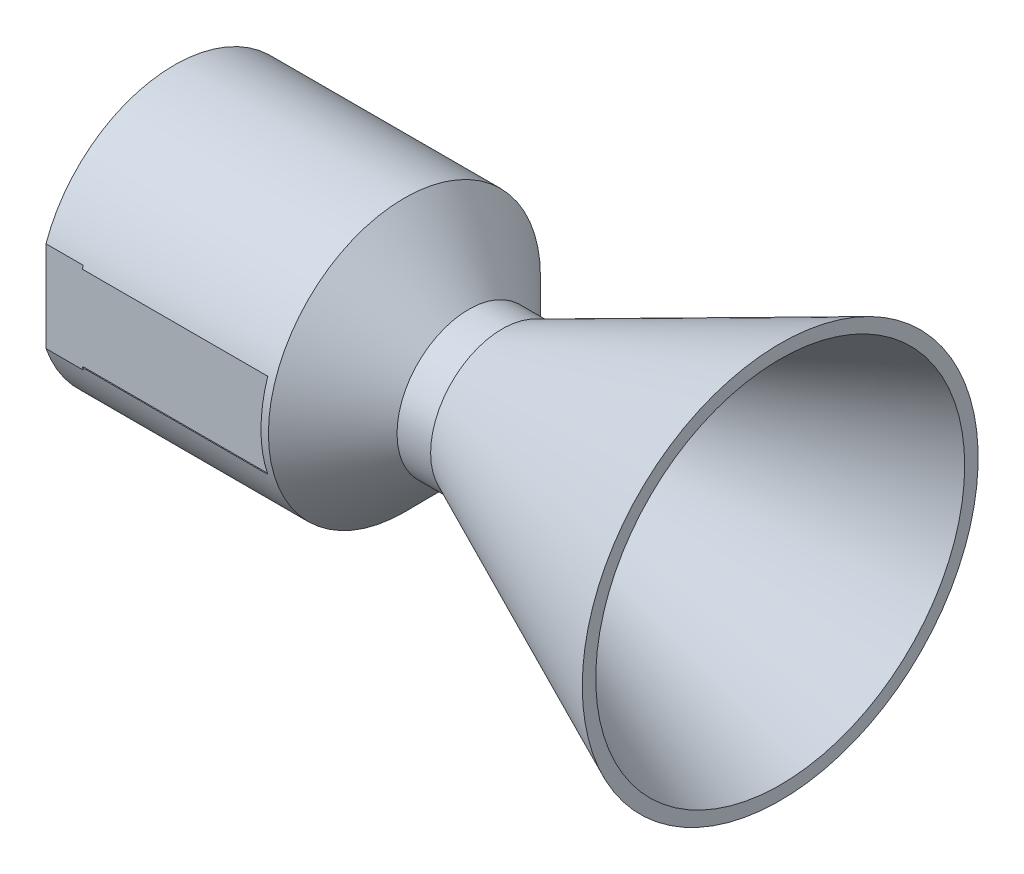
ISO-10303-21;
HEADER;
FILE_DESCRIPTION(('STEP AP214'),'2;1');
FILE_NAME('part.step','',(''),(''),'','','');
FILE_SCHEMA(('AUTOMOTIVE_DESIGN { 1 0 10303 214 1 1 1 1 }'));
ENDSEC;
DATA;
#1=APPLICATION_CONTEXT('core data for automotive mechanical design processes');
#2=APPLICATION_PROTOCOL_DEFINITION('international standard','automotive_design',2000,#1);
#3=PRODUCT_CONTEXT('',#1,'mechanical');
#4=PRODUCT('Part','Part','',(#3));
#5=PRODUCT_RELATED_PRODUCT_CATEGORY('part','',(#4));
#6=PRODUCT_DEFINITION_FORMATION('','',#4);
#7=PRODUCT_DEFINITION_CONTEXT('part definition',#1,'design');
#8=PRODUCT_DEFINITION('design','',#6,#7);
#9=PRODUCT_DEFINITION_SHAPE('','',#8);
#10=(LENGTH_UNIT() NAMED_UNIT(*) SI_UNIT(.MILLI.,.METRE.));
#11=(NAMED_UNIT(*) PLANE_ANGLE_UNIT() SI_UNIT($,.RADIAN.));
#12=(NAMED_UNIT(*) SI_UNIT($,.STERADIAN.) SOLID_ANGLE_UNIT());
#13=UNCERTAINTY_MEASURE_WITH_UNIT(LENGTH_MEASURE(1.E-05),#10,'distance_accuracy_value','');
#14=(GEOMETRIC_REPRESENTATION_CONTEXT(3) GLOBAL_UNCERTAINTY_ASSIGNED_CONTEXT((#13)) GLOBAL_UNIT_ASSIGNED_CONTEXT((#10,
#11,#12)) REPRESENTATION_CONTEXT('',''));
#15=CARTESIAN_POINT('',(0.,0.,0.));
#16=DIRECTION('',(0.,0.,1.));
#17=DIRECTION('',(1.,0.,0.));
#18=AXIS2_PLACEMENT_3D('',#15,#16,#17);
#19=CARTESIAN_POINT('',(-32.3129153036238,0.,-0.0551176881120801));
#20=DIRECTION('',(1.,0.,0.));
#21=DIRECTION('',(0.,0.,-1.));
#22=AXIS2_PLACEMENT_3D('',#19,#20,#21);
#23=PLANE('',#22);
#24=DIRECTION('',(0.,1.,0.));
#25=VECTOR('',#24,1.);
#26=CARTESIAN_POINT('',(-32.3129153036238,11.3983878311036,34.3140971361835));
#27=LINE('',#26,#25);
#28=CARTESIAN_POINT('',(-32.3129153036238,-12.1635987648434,34.3140971361835));
#29=VERTEX_POINT('',#28);
#30=CARTESIAN_POINT('',(-32.3129153036238,-11.3983878311036,34.3140971361835));
#31=VERTEX_POINT('',#30);
#32=EDGE_CURVE('E56',#29,#31,#27,.T.);
#33=ORIENTED_EDGE('',*,*,#32,.F.);
#34=CARTESIAN_POINT('',(-32.3129153036238,0.,-0.0551176881120801));
#35=DIRECTION('',(-1.,0.,0.));
#36=DIRECTION('',(0.,0.,1.));
#37=AXIS2_PLACEMENT_3D('',#34,#35,#36);
#38=CIRCLE('',#37,36.4581412382842);
#39=CARTESIAN_POINT('',(-32.3129153036238,-11.3983878311036,34.5754008959696));
#40=VERTEX_POINT('',#39);
#41=EDGE_CURVE('E180',#29,#40,#38,.T.);
#42=ORIENTED_EDGE('',*,*,#41,.T.);
#43=DIRECTION('',(0.,0.,-1.));
#44=VECTOR('',#43,1.);
#45=CARTESIAN_POINT('',(-32.3129153036238,-11.3983878311036,-0.0551176881120801));
#46=LINE('',#45,#44);
#47=EDGE_CURVE('E197',#40,#31,#46,.T.);
#48=ORIENTED_EDGE('',*,*,#47,.T.);
#49=EDGE_LOOP('',(#33,#42,#48));
#50=FACE_BOUND('',#49,.T.);
#51=ADVANCED_FACE('F46',(#50),#23,.F.);
#52=CARTESIAN_POINT('',(-32.3129153036238,11.3983878311036,34.3140971361835));
#53=VERTEX_POINT('',#52);
#54=CARTESIAN_POINT('',(-32.3129153036238,12.1635987648434,34.3140971361835));
#55=VERTEX_POINT('',#54);
#56=EDGE_CURVE('E12',#53,#55,#27,.T.);
#57=ORIENTED_EDGE('',*,*,#56,.F.);
#58=DIRECTION('',(0.,0.,1.));
#59=VECTOR('',#58,1.);
#60=CARTESIAN_POINT('',(-32.3129153036238,11.3983878311036,34.3140971361835));
#61=LINE('',#60,#59);
#62=CARTESIAN_POINT('',(-32.3129153036238,11.3983878311036,34.5754008959696));
#63=VERTEX_POINT('',#62);
#64=EDGE_CURVE('E153',#53,#63,#61,.T.);
#65=ORIENTED_EDGE('',*,*,#64,.T.);
#66=EDGE_CURVE('E183',#63,#55,#38,.T.);
#67=ORIENTED_EDGE('',*,*,#66,.T.);
#68=EDGE_LOOP('',(#57,#65,#67));
#69=FACE_BOUND('',#68,.T.);
#70=ADVANCED_FACE('F213',(#69),#23,.F.);
#71=CARTESIAN_POINT('',(120.108627169546,0.,-0.0551176881120801));
#72=DIRECTION('',(1.,0.,0.));
#73=DIRECTION('',(0.,0.,-1.));
#74=AXIS2_PLACEMENT_3D('',#71,#72,#73);
#75=PLANE('',#74);
#76=CARTESIAN_POINT('',(120.108627169546,0.,-0.0551176881120801));
#77=DIRECTION('',(-1.,0.,0.));
#78=DIRECTION('',(0.,0.,1.));
#79=AXIS2_PLACEMENT_3D('',#76,#77,#78);
#80=CIRCLE('',#79,49.4432064146147);
#81=CARTESIAN_POINT('',(120.108627169546,0.,-49.4983241027268));
#82=VERTEX_POINT('',#81);
#83=EDGE_CURVE('E168',#82,#82,#80,.T.);
#84=ORIENTED_EDGE('',*,*,#83,.T.);
#85=EDGE_LOOP('',(#84));
#86=FACE_BOUND('',#85,.T.);
#87=CARTESIAN_POINT('',(120.108627169546,0.,-0.0551176881120801));
#88=DIRECTION('',(-1.,0.,0.));
#89=DIRECTION('',(0.,0.,1.));
#90=AXIS2_PLACEMENT_3D('',#87,#88,#89);
#91=CIRCLE('',#90,53.0558164323668);
#92=CARTESIAN_POINT('',(120.108627169546,0.,53.0006987442547));
#93=VERTEX_POINT('',#92);
#94=EDGE_CURVE('E194',#93,#93,#91,.T.);
#95=ORIENTED_EDGE('',*,*,#94,.F.);
#96=EDGE_LOOP('',(#95));
#97=FACE_BOUND('',#96,.T.);
#98=ADVANCED_FACE('F48',(#86,#97),#75,.T.);
#99=CARTESIAN_POINT('',(45.6318795037904,0.,-0.0551176881120801));
#100=DIRECTION('',(1.,0.,0.));
#101=DIRECTION('',(0.,0.,-1.));
#102=AXIS2_PLACEMENT_3D('',#99,#100,#101);
#103=CONICAL_SURFACE('',#102,19.2220939213524,0.426412207877239);
#104=ORIENTED_EDGE('',*,*,#94,.T.);
#105=EDGE_LOOP('',(#104));
#106=FACE_BOUND('',#105,.T.);
#107=CARTESIAN_POINT('',(45.6318795037904,0.,-0.0551176881120801));
#108=DIRECTION('',(-1.,0.,0.));
#109=DIRECTION('',(0.,0.,1.));
#110=AXIS2_PLACEMENT_3D('',#107,#108,#109);
#111=CIRCLE('',#110,19.2220939213524);
#112=CARTESIAN_POINT('',(45.6318795037904,0.,19.1669762332403));
#113=VERTEX_POINT('',#112);
#114=EDGE_CURVE('E191',#113,#113,#111,.T.);
#115=ORIENTED_EDGE('',*,*,#114,.F.);
#116=EDGE_LOOP('',(#115));
#117=FACE_BOUND('',#116,.T.);
#118=ADVANCED_FACE('F238',(#106,#117),#103,.T.);
#119=CARTESIAN_POINT('',(-32.3129153036238,0.,-0.0551176881120801));
#120=DIRECTION('',(-1.,0.,0.));
#121=DIRECTION('',(0.,0.,1.));
#122=AXIS2_PLACEMENT_3D('',#119,#120,#121);
#123=CYLINDRICAL_SURFACE('',#122,19.2220939213524);
#124=ORIENTED_EDGE('',*,*,#114,.T.);
#125=EDGE_LOOP('',(#124));
#126=FACE_BOUND('',#125,.T.);
#127=CARTESIAN_POINT('',(36.6237395480277,0.,-0.0551176881120801));
#128=DIRECTION('',(-1.,0.,0.));
#129=DIRECTION('',(0.,0.,1.));
#130=AXIS2_PLACEMENT_3D('',#127,#128,#129);
#131=CIRCLE('',#130,19.2220939213524);
#132=CARTESIAN_POINT('',(36.6237395480277,0.,19.1669762332403));
#133=VERTEX_POINT('',#132);
#134=EDGE_CURVE('E188',#133,#133,#131,.T.);
#135=ORIENTED_EDGE('',*,*,#134,.F.);
#136=EDGE_LOOP('',(#135));
#137=FACE_BOUND('',#136,.T.);
#138=ADVANCED_FACE('F235',(#126,#137),#123,.T.);
#139=CARTESIAN_POINT('',(19.3876922310955,0.,-0.0551176881120801));
#140=DIRECTION('',(-1.,0.,0.));
#141=DIRECTION('',(0.,0.,1.));
#142=AXIS2_PLACEMENT_3D('',#139,#140,#141);
#143=CONICAL_SURFACE('',#142,36.4581412382842,0.785398163397437);
#144=ORIENTED_EDGE('',*,*,#134,.T.);
#145=EDGE_LOOP('',(#144));
#146=FACE_BOUND('',#145,.T.);
#147=CARTESIAN_POINT('',(19.3876922310955,0.,-0.0551176881120801));
#148=DIRECTION('',(-1.,0.,0.));
#149=DIRECTION('',(0.,0.,1.));
#150=AXIS2_PLACEMENT_3D('',#147,#148,#149);
#151=CIRCLE('',#150,36.4581412382842);
#152=CARTESIAN_POINT('',(19.3876922310955,0.,36.4030235501721));
#153=VERTEX_POINT('',#152);
#154=EDGE_CURVE('E185',#153,#153,#151,.T.);
#155=ORIENTED_EDGE('',*,*,#154,.F.);
#156=EDGE_LOOP('',(#155));
#157=FACE_BOUND('',#156,.T.);
#158=ADVANCED_FACE('F232',(#146,#157),#143,.T.);
#159=CARTESIAN_POINT('',(-32.3129153036238,0.,-0.0551176881120801));
#160=DIRECTION('',(-1.,0.,0.));
#161=DIRECTION('',(0.,0.,1.));
#162=AXIS2_PLACEMENT_3D('',#159,#160,#161);
#163=CYLINDRICAL_SURFACE('',#162,36.4581412382842);
#164=DIRECTION('',(1.,0.,0.));
#165=VECTOR('',#164,1.);
#166=CARTESIAN_POINT('',(-32.3129153036238,11.3983878311036,-34.6856362721937));
#167=LINE('',#166,#165);
#168=CARTESIAN_POINT('',(-42.3129153036238,11.3983878311036,-34.6856362721937));
#169=VERTEX_POINT('',#168);
#170=CARTESIAN_POINT('',(17.3920852119745,11.3983878311036,-34.6856362721937));
#171=VERTEX_POINT('',#170);
#172=EDGE_CURVE('E113',#169,#171,#167,.T.);
#173=ORIENTED_EDGE('',*,*,#172,.F.);
#174=CARTESIAN_POINT('',(-42.3129153036238,0.,-0.0551176881120801));
#175=DIRECTION('',(-1.,0.,0.));
#176=DIRECTION('',(0.,0.,1.));
#177=AXIS2_PLACEMENT_3D('',#174,#175,#176);
#178=CIRCLE('',#177,36.4581412382842);
#179=CARTESIAN_POINT('',(-42.3129153036238,12.1635987648434,34.3140971361835));
#180=VERTEX_POINT('',#179);
#181=EDGE_CURVE('E119',#180,#169,#178,.T.);
#182=ORIENTED_EDGE('',*,*,#181,.F.);
#183=DIRECTION('',(1.,0.,0.));
#184=VECTOR('',#183,1.);
#185=CARTESIAN_POINT('',(-42.3129153036238,12.1635987648434,34.3140971361835));
#186=LINE('',#185,#184);
#187=EDGE_CURVE('E141',#180,#55,#186,.T.);
#188=ORIENTED_EDGE('',*,*,#187,.T.);
#189=ORIENTED_EDGE('',*,*,#66,.F.);
#190=DIRECTION('',(-1.,0.,0.));
#191=VECTOR('',#190,1.);
#192=CARTESIAN_POINT('',(-32.3129153036238,11.3983878311036,34.5754008959696));
#193=LINE('',#192,#191);
#194=CARTESIAN_POINT('',(17.3920852119745,11.3983878311036,34.5754008959696));
#195=VERTEX_POINT('',#194);
#196=EDGE_CURVE('E166',#195,#63,#193,.T.);
#197=ORIENTED_EDGE('',*,*,#196,.F.);
#198=CARTESIAN_POINT('',(17.3920852119745,0.,-0.0551176881120801));
#199=DIRECTION('',(1.,0.,0.));
#200=DIRECTION('',(0.,0.,-1.));
#201=AXIS2_PLACEMENT_3D('',#198,#199,#200);
#202=CIRCLE('',#201,36.4581412382842);
#203=CARTESIAN_POINT('',(17.3920852119745,-11.3983878311036,34.5754008959696));
#204=VERTEX_POINT('',#203);
#205=EDGE_CURVE('E198',#204,#195,#202,.F.);
#206=ORIENTED_EDGE('',*,*,#205,.F.);
#207=DIRECTION('',(-1.,0.,0.));
#208=VECTOR('',#207,1.);
#209=CARTESIAN_POINT('',(-32.3129153036238,-11.3983878311036,34.5754008959696));
#210=LINE('',#209,#208);
#211=EDGE_CURVE('E124',#40,#204,#210,.F.);
#212=ORIENTED_EDGE('',*,*,#211,.F.);
#213=ORIENTED_EDGE('',*,*,#41,.F.);
#214=DIRECTION('',(1.,0.,0.));
#215=VECTOR('',#214,1.);
#216=CARTESIAN_POINT('',(-42.3129153036238,-12.1635987648434,34.3140971361835));
#217=LINE('',#216,#215);
#218=CARTESIAN_POINT('',(-42.3129153036238,-12.1635987648434,34.3140971361835));
#219=VERTEX_POINT('',#218);
#220=EDGE_CURVE('E144',#219,#29,#217,.T.);
#221=ORIENTED_EDGE('',*,*,#220,.F.);
#222=CARTESIAN_POINT('',(-42.3129153036238,0.,-0.0551176881120801));
#223=DIRECTION('',(-1.,0.,0.));
#224=DIRECTION('',(0.,0.,1.));
#225=AXIS2_PLACEMENT_3D('',#222,#223,#224);
#226=CIRCLE('',#225,36.4581412382842);
#227=CARTESIAN_POINT('',(-42.3129153036238,-11.3983878311036,-34.6856362721937));
#228=VERTEX_POINT('',#227);
#229=EDGE_CURVE('E132',#228,#219,#226,.T.);
#230=ORIENTED_EDGE('',*,*,#229,.F.);
#231=DIRECTION('',(1.,0.,0.));
#232=VECTOR('',#231,1.);
#233=CARTESIAN_POINT('',(-32.3129153036238,-11.3983878311036,-34.6856362721937));
#234=LINE('',#233,#232);
#235=CARTESIAN_POINT('',(17.3920852119745,-11.3983878311036,-34.6856362721937));
#236=VERTEX_POINT('',#235);
#237=EDGE_CURVE('E125',#228,#236,#234,.T.);
#238=ORIENTED_EDGE('',*,*,#237,.T.);
#239=CARTESIAN_POINT('',(17.3920852119745,0.,-0.0551176881120801));
#240=DIRECTION('',(1.,0.,0.));
#241=DIRECTION('',(0.,0.,-1.));
#242=AXIS2_PLACEMENT_3D('',#239,#240,#241);
#243=CIRCLE('',#242,36.4581412382842);
#244=EDGE_CURVE('E50',#171,#236,#243,.F.);
#245=ORIENTED_EDGE('',*,*,#244,.F.);
#246=EDGE_LOOP('',(#173,#182,#188,#189,#197,#206,#212,#213,#221,#230,#238,#245));
#247=FACE_BOUND('',#246,.T.);
#248=ORIENTED_EDGE('',*,*,#154,.T.);
#249=EDGE_LOOP('',(#248));
#250=FACE_BOUND('',#249,.T.);
#251=ADVANCED_FACE('F115',(#247,#250),#163,.T.);
#252=CARTESIAN_POINT('',(-32.3129153036238,0.,-0.0551176881120801));
#253=DIRECTION('',(-1.,0.,0.));
#254=DIRECTION('',(0.,0.,1.));
#255=AXIS2_PLACEMENT_3D('',#252,#253,#254);
#256=CYLINDRICAL_SURFACE('',#255,31.7842469209473);
#257=CARTESIAN_POINT('',(19.3876922310955,0.,-0.0551176881120801));
#258=DIRECTION('',(-1.,0.,0.));
#259=DIRECTION('',(0.,0.,1.));
#260=AXIS2_PLACEMENT_3D('',#257,#258,#259);
#261=CIRCLE('',#260,31.7842469209473);
#262=CARTESIAN_POINT('',(19.3876922310955,0.,31.7291292328352));
#263=VERTEX_POINT('',#262);
#264=EDGE_CURVE('E177',#263,#263,#261,.T.);
#265=ORIENTED_EDGE('',*,*,#264,.F.);
#266=EDGE_LOOP('',(#265));
#267=FACE_BOUND('',#266,.T.);
#268=CARTESIAN_POINT('',(-32.3129153036238,0.,-0.0551176881120801));
#269=DIRECTION('',(-1.,0.,0.));
#270=DIRECTION('',(0.,0.,1.));
#271=AXIS2_PLACEMENT_3D('',#268,#269,#270);
#272=CIRCLE('',#271,31.7842469209473);
#273=CARTESIAN_POINT('',(-32.3129153036238,0.,31.7291292328352));
#274=VERTEX_POINT('',#273);
#275=EDGE_CURVE('E147',#274,#274,#272,.T.);
#276=ORIENTED_EDGE('',*,*,#275,.T.);
#277=EDGE_LOOP('',(#276));
#278=FACE_BOUND('',#277,.T.);
#279=ADVANCED_FACE('F228',(#267,#278),#256,.F.);
#280=CARTESIAN_POINT('',(19.3876922310955,0.,-0.0551176881120801));
#281=DIRECTION('',(-1.,0.,0.));
#282=DIRECTION('',(0.,0.,1.));
#283=AXIS2_PLACEMENT_3D('',#280,#281,#282);
#284=CONICAL_SURFACE('',#283,31.7842469209473,0.785398163397436);
#285=CARTESIAN_POINT('',(35.6123372706298,0.,-0.0551176881120801));
#286=DIRECTION('',(-1.,0.,0.));
#287=DIRECTION('',(0.,0.,1.));
#288=AXIS2_PLACEMENT_3D('',#285,#286,#287);
#289=CIRCLE('',#288,15.5596018814134);
#290=CARTESIAN_POINT('',(35.6123372706298,0.,15.5044841933013));
#291=VERTEX_POINT('',#290);
#292=EDGE_CURVE('E174',#291,#291,#289,.T.);
#293=ORIENTED_EDGE('',*,*,#292,.F.);
#294=EDGE_LOOP('',(#293));
#295=FACE_BOUND('',#294,.T.);
#296=ORIENTED_EDGE('',*,*,#264,.T.);
#297=EDGE_LOOP('',(#296));
#298=FACE_BOUND('',#297,.T.);
#299=ADVANCED_FACE('F267',(#295,#298),#284,.F.);
#300=CARTESIAN_POINT('',(-32.3129153036238,0.,-0.0551176881120801));
#301=DIRECTION('',(-1.,0.,0.));
#302=DIRECTION('',(0.,0.,1.));
#303=AXIS2_PLACEMENT_3D('',#300,#301,#302);
#304=CYLINDRICAL_SURFACE('',#303,15.5596018814134);
#305=CARTESIAN_POINT('',(45.6318795037904,0.,-0.0551176881120801));
#306=DIRECTION('',(-1.,0.,0.));
#307=DIRECTION('',(0.,0.,1.));
#308=AXIS2_PLACEMENT_3D('',#305,#306,#307);
#309=CIRCLE('',#308,15.5596018814134);
#310=CARTESIAN_POINT('',(45.6318795037904,0.,-15.6147195695255));
#311=VERTEX_POINT('',#310);
#312=EDGE_CURVE('E171',#311,#311,#309,.T.);
#313=ORIENTED_EDGE('',*,*,#312,.F.);
#314=EDGE_LOOP('',(#313));
#315=FACE_BOUND('',#314,.T.);
#316=ORIENTED_EDGE('',*,*,#292,.T.);
#317=EDGE_LOOP('',(#316));
#318=FACE_BOUND('',#317,.T.);
#319=ADVANCED_FACE('F261',(#315,#318),#304,.F.);
#320=CARTESIAN_POINT('',(45.6318795037904,0.,-0.0551176881120801));
#321=DIRECTION('',(1.,0.,0.));
#322=DIRECTION('',(0.,0.,-1.));
#323=AXIS2_PLACEMENT_3D('',#320,#321,#322);
#324=CONICAL_SURFACE('',#323,15.5596018814134,0.426967256807075);
#325=CARTESIAN_POINT('',(120.108627169546,0.,-49.4983241027268));
#326=CARTESIAN_POINT('',(119.332827714694,0.,-49.1453698888393));
#327=CARTESIAN_POINT('',(118.557028259843,0.,-48.7924156749518));
#328=CARTESIAN_POINT('',(117.005429350139,0.,-48.0865072471767));
#329=CARTESIAN_POINT('',(116.229629895288,0.,-47.7335530332892));
#330=CARTESIAN_POINT('',(114.678030985585,0.,-47.0276446055142));
#331=CARTESIAN_POINT('',(113.902231530733,0.,-46.6746903916267));
#332=CARTESIAN_POINT('',(112.35063262103,0.,-45.9687819638517));
#333=CARTESIAN_POINT('',(111.574833166178,0.,-45.6158277499642));
#334=CARTESIAN_POINT('',(110.023234256475,0.,-44.9099193221891));
#335=CARTESIAN_POINT('',(109.247434801623,0.,-44.5569651083016));
#336=CARTESIAN_POINT('',(107.69583589192,0.,-43.8510566805266));
#337=CARTESIAN_POINT('',(106.920036437068,0.,-43.4981024666391));
#338=CARTESIAN_POINT('',(105.368437527365,0.,-42.792194038864));
#339=CARTESIAN_POINT('',(104.592638072514,0.,-42.4392398249765));
#340=CARTESIAN_POINT('',(103.04103916281,0.,-41.7333313972015));
#341=CARTESIAN_POINT('',(102.265239707959,0.,-41.380377183314));
#342=CARTESIAN_POINT('',(100.713640798255,0.,-40.674468755539));
#343=CARTESIAN_POINT('',(99.9378413434038,0.,-40.3215145416514));
#344=CARTESIAN_POINT('',(98.3862424337006,0.,-39.6156061138764));
#345=CARTESIAN_POINT('',(97.6104429788489,0.,-39.2626518999889));
#346=CARTESIAN_POINT('',(96.0588440691457,0.,-38.5567434722139));
#347=CARTESIAN_POINT('',(95.2830446142941,0.,-38.2037892583264));
#348=CARTESIAN_POINT('',(93.7314457045908,0.,-37.4978808305513));
#349=CARTESIAN_POINT('',(92.9556462497392,0.,-37.1449266166638));
#350=CARTESIAN_POINT('',(91.404047340036,0.,-36.4390181888888));
#351=CARTESIAN_POINT('',(90.6282478851844,0.,-36.0860639750013));
#352=CARTESIAN_POINT('',(89.0766489754811,0.,-35.3801555472263));
#353=CARTESIAN_POINT('',(88.3008495206295,0.,-35.0272013333387));
#354=CARTESIAN_POINT('',(86.7492506109262,0.,-34.3212929055637));
#355=CARTESIAN_POINT('',(85.9734511560746,0.,-33.9683386916762));
#356=CARTESIAN_POINT('',(84.4218522463714,0.,-33.2624302639012));
#357=CARTESIAN_POINT('',(83.6460527915198,0.,-32.9094760500137));
#358=CARTESIAN_POINT('',(82.0944538818165,0.,-32.2035676222386));
#359=CARTESIAN_POINT('',(81.3186544269649,0.,-31.8506134083511));
#360=CARTESIAN_POINT('',(79.7670555172617,0.,-31.1447049805761));
#361=CARTESIAN_POINT('',(78.99125606241,0.,-30.7917507666886));
#362=CARTESIAN_POINT('',(77.4396571527068,0.,-30.0858423389136));
#363=CARTESIAN_POINT('',(76.6638576978552,0.,-29.732888125026));
#364=CARTESIAN_POINT('',(75.1122587881519,0.,-29.026979697251));
#365=CARTESIAN_POINT('',(74.3364593333003,0.,-28.6740254833635));
#366=CARTESIAN_POINT('',(72.7848604235971,0.,-27.9681170555885));
#367=CARTESIAN_POINT('',(72.0090609687455,0.,-27.615162841701));
#368=CARTESIAN_POINT('',(70.4574620590422,0.,-26.9092544139259));
#369=CARTESIAN_POINT('',(69.6816626041906,0.,-26.5563002000384));
#370=CARTESIAN_POINT('',(68.1300636944873,0.,-25.8503917722634));
#371=CARTESIAN_POINT('',(67.3542642396357,0.,-25.4974375583759));
#372=CARTESIAN_POINT('',(65.8026653299325,0.,-24.7915291306008));
#373=CARTESIAN_POINT('',(65.0268658750809,0.,-24.4385749167133));
#374=CARTESIAN_POINT('',(63.4752669653776,0.,-23.7326664889383));
#375=CARTESIAN_POINT('',(62.699467510526,0.,-23.3797122750508));
#376=CARTESIAN_POINT('',(61.1478686008228,0.,-22.6738038472758));
#377=CARTESIAN_POINT('',(60.3720691459712,0.,-22.3208496333883));
#378=CARTESIAN_POINT('',(58.8204702362679,0.,-21.6149412056132));
#379=CARTESIAN_POINT('',(58.0446707814163,0.,-21.2619869917257));
#380=CARTESIAN_POINT('',(56.493071871713,0.,-20.5560785639507));
#381=CARTESIAN_POINT('',(55.7172724168614,0.,-20.2031243500632));
#382=CARTESIAN_POINT('',(54.1656735071582,0.,-19.4972159222881));
#383=CARTESIAN_POINT('',(53.3898740523066,0.,-19.1442617084006));
#384=CARTESIAN_POINT('',(51.8382751426033,0.,-18.4383532806256));
#385=CARTESIAN_POINT('',(51.0624756877517,0.,-18.0853990667381));
#386=CARTESIAN_POINT('',(49.5108767780485,0.,-17.3794906389631));
#387=CARTESIAN_POINT('',(48.7350773231968,0.,-17.0265364250755));
#388=CARTESIAN_POINT('',(47.1834784134936,0.,-16.3206279973005));
#389=CARTESIAN_POINT('',(46.407678958642,0.,-15.967673783413));
#390=CARTESIAN_POINT('',(45.6318795037904,0.,-15.6147195695255));
#391=B_SPLINE_CURVE_WITH_KNOTS('',3,(#325,#326,#327,#328,#329,#330,#331,#332,#333,#334,#335,
#336,#337,#338,#339,#340,#341,#342,#343,#344,#345,#346,#347,#348,#349,#350,#351,#352,#353,#354,
#355,#356,#357,#358,#359,#360,#361,#362,#363,#364,#365,#366,#367,#368,#369,#370,#371,#372,#373,
#374,#375,#376,#377,#378,#379,#380,#381,#382,#383,#384,#385,#386,#387,#388,#389,#390),
.UNSPECIFIED.,.F.,.F.,(4,2,2,2,2,2,2,2,2,2,2,2,2,2,2,2,2,2,2,2,2,2,2,2,2,2,2,2,2,2,2,2,4),(0.,
2.55694607710864,5.11389215421726,7.6708382313259,10.2277843084345,12.7847303855432,
15.3416764626518,17.8986225397604,20.455568616869,23.0125146939777,25.5694607710863,
28.1264068481949,30.6833529253036,33.2402990024122,35.7972450795208,38.3541911566295,
40.9111372337381,43.4680833108467,46.0250293879554,48.581975465064,51.1389215421726,
53.6958676192813,56.2528136963899,58.8097597734985,61.3667058506072,63.9236519277158,
66.4805980048244,69.0375440819331,71.5944901590417,74.1514362361503,76.708382313259,
79.2653283903676,81.8222744674762),.UNSPECIFIED.);
#392=EDGE_CURVE('BSEAM258',#82,#311,#391,.T.);
#393=ORIENTED_EDGE('',*,*,#83,.F.);
#394=ORIENTED_EDGE('',*,*,#312,.T.);
#395=ORIENTED_EDGE('',*,*,#392,.T.);
#396=ORIENTED_EDGE('',*,*,#392,.F.);
#397=EDGE_LOOP('',(#393,#395,#394,#396));
#398=FACE_BOUND('',#397,.T.);
#399=ADVANCED_FACE('F258',(#398),#324,.F.);
#400=CARTESIAN_POINT('',(-32.3129153036238,11.3983878311036,34.3140971361835));
#401=DIRECTION('',(0.,1.,0.));
#402=DIRECTION('',(0.,0.,1.));
#403=AXIS2_PLACEMENT_3D('',#400,#401,#402);
#404=PLANE('',#403);
#405=ORIENTED_EDGE('',*,*,#196,.T.);
#406=ORIENTED_EDGE('',*,*,#64,.F.);
#407=DIRECTION('',(1.,0.,0.));
#408=VECTOR('',#407,1.);
#409=CARTESIAN_POINT('',(-32.3129153036238,11.3983878311036,34.3140971361835));
#410=LINE('',#409,#408);
#411=CARTESIAN_POINT('',(17.3920852119745,11.3983878311036,34.3140971361835));
#412=VERTEX_POINT('',#411);
#413=EDGE_CURVE('E154',#53,#412,#410,.T.);
#414=ORIENTED_EDGE('',*,*,#413,.T.);
#415=DIRECTION('',(0.,0.,1.));
#416=VECTOR('',#415,1.);
#417=CARTESIAN_POINT('',(17.3920852119745,11.3983878311036,34.3140971361835));
#418=LINE('',#417,#416);
#419=EDGE_CURVE('E156',#412,#195,#418,.T.);
#420=ORIENTED_EDGE('',*,*,#419,.T.);
#421=EDGE_LOOP('',(#405,#406,#414,#420));
#422=FACE_BOUND('',#421,.T.);
#423=ADVANCED_FACE('F216',(#422),#404,.F.);
#424=CARTESIAN_POINT('',(-32.3129153036238,-11.3983878311036,34.3140971361835));
#425=DIRECTION('',(0.,0.,-1.));
#426=DIRECTION('',(-1.,0.,0.));
#427=AXIS2_PLACEMENT_3D('',#424,#425,#426);
#428=PLANE('',#427);
#429=DIRECTION('',(0.,1.,0.));
#430=VECTOR('',#429,1.);
#431=CARTESIAN_POINT('',(17.3920852119745,-11.3983878311036,34.3140971361835));
#432=LINE('',#431,#430);
#433=CARTESIAN_POINT('',(17.3920852119745,-11.3983878311036,34.3140971361835));
#434=VERTEX_POINT('',#433);
#435=EDGE_CURVE('E159',#434,#412,#432,.T.);
#436=ORIENTED_EDGE('',*,*,#435,.T.);
#437=ORIENTED_EDGE('',*,*,#413,.F.);
#438=ORIENTED_EDGE('',*,*,#56,.T.);
#439=ORIENTED_EDGE('',*,*,#187,.F.);
#440=DIRECTION('',(0.,1.,0.));
#441=VECTOR('',#440,1.);
#442=CARTESIAN_POINT('',(-42.3129153036238,-11.3983878311036,34.3140971361835));
#443=LINE('',#442,#441);
#444=EDGE_CURVE('E136',#219,#180,#443,.T.);
#445=ORIENTED_EDGE('',*,*,#444,.F.);
#446=ORIENTED_EDGE('',*,*,#220,.T.);
#447=ORIENTED_EDGE('',*,*,#32,.T.);
#448=DIRECTION('',(1.,0.,0.));
#449=VECTOR('',#448,1.);
#450=CARTESIAN_POINT('',(-32.3129153036238,-11.3983878311036,34.3140971361835));
#451=LINE('',#450,#449);
#452=EDGE_CURVE('E70',#31,#434,#451,.T.);
#453=ORIENTED_EDGE('',*,*,#452,.T.);
#454=EDGE_LOOP('',(#436,#437,#438,#439,#445,#446,#447,#453));
#455=FACE_BOUND('',#454,.T.);
#456=ADVANCED_FACE('F208',(#455),#428,.F.);
#457=CARTESIAN_POINT('',(-32.3129153036238,-11.3983878311036,34.3140971361835));
#458=DIRECTION('',(0.,-1.,0.));
#459=DIRECTION('',(0.,0.,-1.));
#460=AXIS2_PLACEMENT_3D('',#457,#458,#459);
#461=PLANE('',#460);
#462=ORIENTED_EDGE('',*,*,#211,.T.);
#463=DIRECTION('',(0.,0.,-1.));
#464=VECTOR('',#463,1.);
#465=CARTESIAN_POINT('',(17.3920852119745,-11.3983878311036,34.3140971361835));
#466=LINE('',#465,#464);
#467=EDGE_CURVE('E149',#204,#434,#466,.T.);
#468=ORIENTED_EDGE('',*,*,#467,.T.);
#469=ORIENTED_EDGE('',*,*,#452,.F.);
#470=ORIENTED_EDGE('',*,*,#47,.F.);
#471=EDGE_LOOP('',(#462,#468,#469,#470));
#472=FACE_BOUND('',#471,.T.);
#473=ADVANCED_FACE('F219',(#472),#461,.F.);
#474=CARTESIAN_POINT('',(17.3920852119745,0.,-0.0551176881120826));
#475=DIRECTION('',(1.,0.,0.));
#476=DIRECTION('',(0.,0.,-1.));
#477=AXIS2_PLACEMENT_3D('',#474,#475,#476);
#478=PLANE('',#477);
#479=ORIENTED_EDGE('',*,*,#205,.T.);
#480=ORIENTED_EDGE('',*,*,#419,.F.);
#481=ORIENTED_EDGE('',*,*,#435,.F.);
#482=ORIENTED_EDGE('',*,*,#467,.F.);
#483=EDGE_LOOP('',(#479,#480,#481,#482));
#484=FACE_BOUND('',#483,.T.);
#485=ADVANCED_FACE('F218',(#484),#478,.F.);
#486=CARTESIAN_POINT('',(-32.3129153036238,-11.3983878311036,-34.6856362721937));
#487=DIRECTION('',(0.,0.,1.));
#488=DIRECTION('',(1.,0.,0.));
#489=AXIS2_PLACEMENT_3D('',#486,#487,#488);
#490=PLANE('',#489);
#491=DIRECTION('',(0.,-1.,0.));
#492=VECTOR('',#491,1.);
#493=CARTESIAN_POINT('',(17.3920852119745,-11.3983878311036,-34.6856362721937));
#494=LINE('',#493,#492);
#495=EDGE_CURVE('E148',#171,#236,#494,.T.);
#496=ORIENTED_EDGE('',*,*,#495,.T.);
#497=ORIENTED_EDGE('',*,*,#237,.F.);
#498=DIRECTION('',(0.,-1.,0.));
#499=VECTOR('',#498,1.);
#500=CARTESIAN_POINT('',(-42.3129153036238,11.3983878311036,-34.6856362721937));
#501=LINE('',#500,#499);
#502=EDGE_CURVE('E128',#169,#228,#501,.T.);
#503=ORIENTED_EDGE('',*,*,#502,.F.);
#504=ORIENTED_EDGE('',*,*,#172,.T.);
#505=EDGE_LOOP('',(#496,#497,#503,#504));
#506=FACE_BOUND('',#505,.T.);
#507=ADVANCED_FACE('F129',(#506),#490,.F.);
#508=CARTESIAN_POINT('',(17.3920852119745,0.,-0.0551176881120826));
#509=DIRECTION('',(1.,0.,0.));
#510=DIRECTION('',(0.,0.,-1.));
#511=AXIS2_PLACEMENT_3D('',#508,#509,#510);
#512=PLANE('',#511);
#513=ORIENTED_EDGE('',*,*,#244,.T.);
#514=ORIENTED_EDGE('',*,*,#495,.F.);
#515=EDGE_LOOP('',(#513,#514));
#516=FACE_BOUND('',#515,.T.);
#517=ADVANCED_FACE('F204',(#516),#512,.F.);
#518=CARTESIAN_POINT('',(-42.3129153036238,0.,-0.0551176881120801));
#519=DIRECTION('',(-1.,0.,0.));
#520=DIRECTION('',(0.,0.,1.));
#521=AXIS2_PLACEMENT_3D('',#518,#519,#520);
#522=PLANE('',#521);
#523=ORIENTED_EDGE('',*,*,#181,.T.);
#524=ORIENTED_EDGE('',*,*,#502,.T.);
#525=ORIENTED_EDGE('',*,*,#229,.T.);
#526=ORIENTED_EDGE('',*,*,#444,.T.);
#527=EDGE_LOOP('',(#523,#524,#525,#526));
#528=FACE_BOUND('',#527,.T.);
#529=ADVANCED_FACE('F134',(#528),#522,.T.);
#530=CARTESIAN_POINT('',(-32.3129153036238,0.,-0.0551176881120801));
#531=DIRECTION('',(-1.,0.,0.));
#532=DIRECTION('',(0.,0.,1.));
#533=AXIS2_PLACEMENT_3D('',#530,#531,#532);
#534=PLANE('',#533);
#535=ORIENTED_EDGE('',*,*,#275,.F.);
#536=EDGE_LOOP('',(#535));
#537=FACE_BOUND('',#536,.T.);
#538=ADVANCED_FACE('F279',(#537),#534,.F.);
#539=CLOSED_SHELL('',(#51,#70,#98,#118,#138,#158,#251,#279,#299,#319,#399,#423,#456,#473,#485,
#507,#517,#529,#538));
#540=MANIFOLD_SOLID_BREP('B2',#539);
#541=ADVANCED_BREP_SHAPE_REPRESENTATION('',(#18,#540),#14);
#542=SHAPE_DEFINITION_REPRESENTATION(#9,#541);
ENDSEC;
END-ISO-10303-21;
